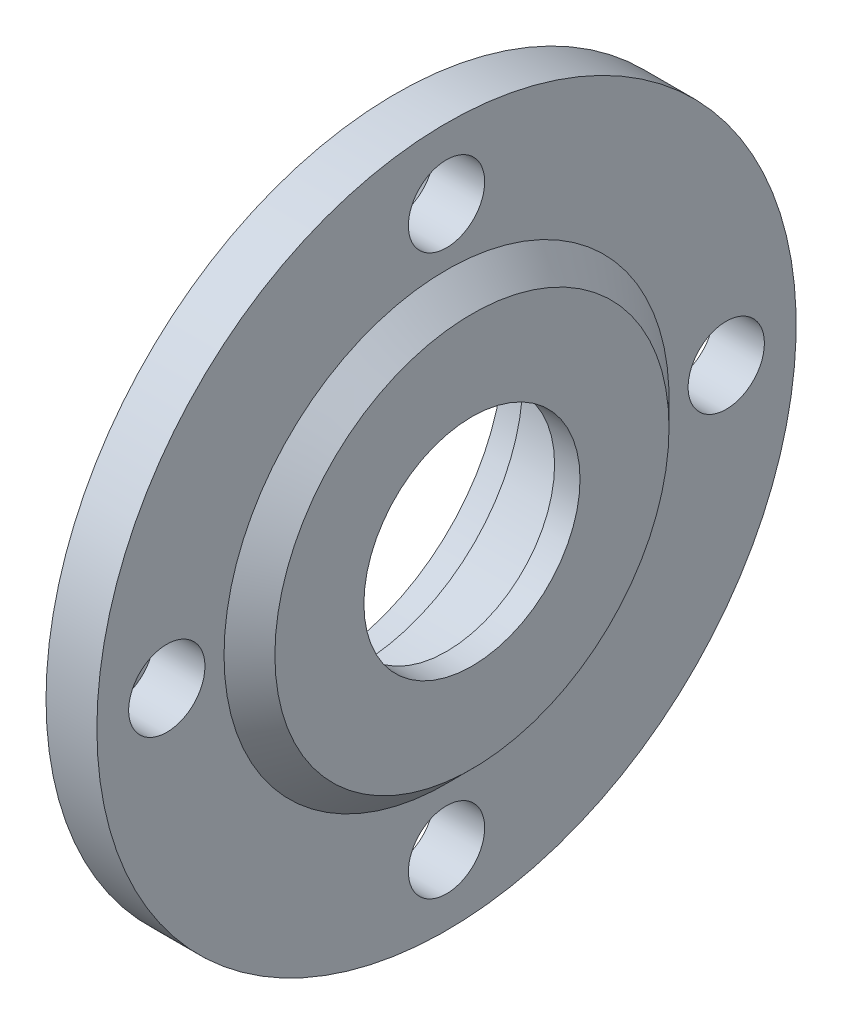
ISO-10303-21;
HEADER;
FILE_DESCRIPTION(('STEP AP214'),'2;1');
FILE_NAME('part.step','',(''),(''),'','','');
FILE_SCHEMA(('AUTOMOTIVE_DESIGN { 1 0 10303 214 1 1 1 1 }'));
ENDSEC;
DATA;
#1=APPLICATION_CONTEXT('core data for automotive mechanical design processes');
#2=APPLICATION_PROTOCOL_DEFINITION('international standard','automotive_design',2000,#1);
#3=PRODUCT_CONTEXT('',#1,'mechanical');
#4=PRODUCT('Part','Part','',(#3));
#5=PRODUCT_RELATED_PRODUCT_CATEGORY('part','',(#4));
#6=PRODUCT_DEFINITION_FORMATION('','',#4);
#7=PRODUCT_DEFINITION_CONTEXT('part definition',#1,'design');
#8=PRODUCT_DEFINITION('design','',#6,#7);
#9=PRODUCT_DEFINITION_SHAPE('','',#8);
#10=(LENGTH_UNIT() NAMED_UNIT(*) SI_UNIT(.MILLI.,.METRE.));
#11=(NAMED_UNIT(*) PLANE_ANGLE_UNIT() SI_UNIT($,.RADIAN.));
#12=(NAMED_UNIT(*) SI_UNIT($,.STERADIAN.) SOLID_ANGLE_UNIT());
#13=UNCERTAINTY_MEASURE_WITH_UNIT(LENGTH_MEASURE(1.E-05),#10,'distance_accuracy_value','');
#14=(GEOMETRIC_REPRESENTATION_CONTEXT(3) GLOBAL_UNCERTAINTY_ASSIGNED_CONTEXT((#13)) GLOBAL_UNIT_ASSIGNED_CONTEXT((#10,
#11,#12)) REPRESENTATION_CONTEXT('',''));
#15=CARTESIAN_POINT('',(0.,0.,0.));
#16=DIRECTION('',(0.,0.,1.));
#17=DIRECTION('',(1.,0.,0.));
#18=AXIS2_PLACEMENT_3D('',#15,#16,#17);
#19=CARTESIAN_POINT('',(18.8922012735046,0.,-13.));
#20=DIRECTION('',(1.,0.,0.));
#21=DIRECTION('',(0.,0.,-1.));
#22=AXIS2_PLACEMENT_3D('',#19,#20,#21);
#23=PLANE('',#22);
#24=CARTESIAN_POINT('',(18.8922012735046,0.,0.));
#25=DIRECTION('',(-1.,0.,0.));
#26=DIRECTION('',(0.,0.,1.));
#27=AXIS2_PLACEMENT_3D('',#24,#25,#26);
#28=CIRCLE('',#27,8.5);
#29=CARTESIAN_POINT('',(18.8922012735046,0.,8.5));
#30=VERTEX_POINT('',#29);
#31=EDGE_CURVE('E10',#30,#30,#28,.T.);
#32=ORIENTED_EDGE('',*,*,#31,.F.);
#33=EDGE_LOOP('',(#32));
#34=FACE_BOUND('',#33,.T.);
#35=CARTESIAN_POINT('',(18.8922012735046,0.,0.));
#36=DIRECTION('',(-1.,0.,0.));
#37=DIRECTION('',(0.,0.,1.));
#38=AXIS2_PLACEMENT_3D('',#35,#36,#37);
#39=CIRCLE('',#38,13.);
#40=CARTESIAN_POINT('',(18.8922012735046,0.,13.));
#41=VERTEX_POINT('',#40);
#42=EDGE_CURVE('E70',#41,#41,#39,.T.);
#43=ORIENTED_EDGE('',*,*,#42,.T.);
#44=EDGE_LOOP('',(#43));
#45=FACE_BOUND('',#44,.T.);
#46=ADVANCED_FACE('F37',(#34,#45),#23,.F.);
#47=CARTESIAN_POINT('',(0.,0.,0.));
#48=DIRECTION('',(-1.,0.,0.));
#49=DIRECTION('',(0.,0.,1.));
#50=AXIS2_PLACEMENT_3D('',#47,#48,#49);
#51=CYLINDRICAL_SURFACE('',#50,8.5);
#52=CARTESIAN_POINT('',(20.8922012735046,0.,0.));
#53=DIRECTION('',(-1.,0.,0.));
#54=DIRECTION('',(0.,0.,1.));
#55=AXIS2_PLACEMENT_3D('',#52,#53,#54);
#56=CIRCLE('',#55,8.5);
#57=CARTESIAN_POINT('',(20.8922012735046,0.,8.5));
#58=VERTEX_POINT('',#57);
#59=EDGE_CURVE('E45',#58,#58,#56,.T.);
#60=ORIENTED_EDGE('',*,*,#59,.F.);
#61=EDGE_LOOP('',(#60));
#62=FACE_BOUND('',#61,.T.);
#63=ORIENTED_EDGE('',*,*,#31,.T.);
#64=EDGE_LOOP('',(#63));
#65=FACE_BOUND('',#64,.T.);
#66=ADVANCED_FACE('F122',(#62,#65),#51,.F.);
#67=CARTESIAN_POINT('',(20.8922012735046,0.,-8.5));
#68=DIRECTION('',(-1.,0.,0.));
#69=DIRECTION('',(0.,0.,1.));
#70=AXIS2_PLACEMENT_3D('',#67,#68,#69);
#71=PLANE('',#70);
#72=CARTESIAN_POINT('',(20.8922012735046,0.,0.));
#73=DIRECTION('',(-1.,0.,0.));
#74=DIRECTION('',(0.,0.,1.));
#75=AXIS2_PLACEMENT_3D('',#72,#73,#74);
#76=CIRCLE('',#75,15.5);
#77=CARTESIAN_POINT('',(20.8922012735046,0.,15.5));
#78=VERTEX_POINT('',#77);
#79=EDGE_CURVE('E51',#78,#78,#76,.T.);
#80=ORIENTED_EDGE('',*,*,#79,.F.);
#81=EDGE_LOOP('',(#80));
#82=FACE_BOUND('',#81,.T.);
#83=ORIENTED_EDGE('',*,*,#59,.T.);
#84=EDGE_LOOP('',(#83));
#85=FACE_BOUND('',#84,.T.);
#86=ADVANCED_FACE('F119',(#82,#85),#71,.F.);
#87=CARTESIAN_POINT('',(20.8922012735046,0.,0.));
#88=DIRECTION('',(-1.,0.,0.));
#89=DIRECTION('',(0.,0.,1.));
#90=AXIS2_PLACEMENT_3D('',#87,#88,#89);
#91=CONICAL_SURFACE('',#90,15.5,0.785398163397447);
#92=CARTESIAN_POINT('',(18.8922012735046,0.,0.));
#93=DIRECTION('',(-1.,0.,0.));
#94=DIRECTION('',(0.,0.,1.));
#95=AXIS2_PLACEMENT_3D('',#92,#93,#94);
#96=CIRCLE('',#95,17.5);
#97=CARTESIAN_POINT('',(18.8922012735046,0.,17.5));
#98=VERTEX_POINT('',#97);
#99=EDGE_CURVE('E110',#98,#98,#96,.T.);
#100=ORIENTED_EDGE('',*,*,#99,.F.);
#101=EDGE_LOOP('',(#100));
#102=FACE_BOUND('',#101,.T.);
#103=ORIENTED_EDGE('',*,*,#79,.T.);
#104=EDGE_LOOP('',(#103));
#105=FACE_BOUND('',#104,.T.);
#106=ADVANCED_FACE('F117',(#102,#105),#91,.T.);
#107=CARTESIAN_POINT('',(18.8922012735046,0.,-17.5));
#108=DIRECTION('',(-1.,0.,0.));
#109=DIRECTION('',(0.,0.,1.));
#110=AXIS2_PLACEMENT_3D('',#107,#108,#109);
#111=PLANE('',#110);
#112=CARTESIAN_POINT('',(18.8922012735046,22.,0.));
#113=DIRECTION('',(1.,0.,0.));
#114=DIRECTION('',(0.,0.,-1.));
#115=AXIS2_PLACEMENT_3D('',#112,#113,#114);
#116=CIRCLE('',#115,3.);
#117=CARTESIAN_POINT('',(18.8922012735046,22.,-3.));
#118=VERTEX_POINT('',#117);
#119=EDGE_CURVE('E60',#118,#118,#116,.T.);
#120=ORIENTED_EDGE('',*,*,#119,.F.);
#121=EDGE_LOOP('',(#120));
#122=FACE_BOUND('',#121,.T.);
#123=CARTESIAN_POINT('',(18.8922012735046,6.21236273031702E-13,-22.0000000000006));
#124=DIRECTION('',(1.,0.,0.));
#125=DIRECTION('',(0.,0.,-1.));
#126=AXIS2_PLACEMENT_3D('',#123,#124,#125);
#127=CIRCLE('',#126,3.00000000000049);
#128=CARTESIAN_POINT('',(18.8922012735046,6.21236273031702E-13,-25.0000000000011));
#129=VERTEX_POINT('',#128);
#130=EDGE_CURVE('E187',#129,#129,#127,.T.);
#131=ORIENTED_EDGE('',*,*,#130,.F.);
#132=EDGE_LOOP('',(#131));
#133=FACE_BOUND('',#132,.T.);
#134=CARTESIAN_POINT('',(18.8922012735046,-22.,-1.2424725460634E-12));
#135=DIRECTION('',(1.,0.,0.));
#136=DIRECTION('',(0.,0.,-1.));
#137=AXIS2_PLACEMENT_3D('',#134,#135,#136);
#138=CIRCLE('',#137,3.00000000000133);
#139=CARTESIAN_POINT('',(18.8922012735046,-22.,-3.00000000000258));
#140=VERTEX_POINT('',#139);
#141=EDGE_CURVE('E191',#140,#140,#138,.T.);
#142=ORIENTED_EDGE('',*,*,#141,.F.);
#143=EDGE_LOOP('',(#142));
#144=FACE_BOUND('',#143,.T.);
#145=CARTESIAN_POINT('',(18.8922012735046,-6.23930495989826E-13,21.9999999999994));
#146=DIRECTION('',(1.,0.,0.));
#147=DIRECTION('',(0.,0.,-1.));
#148=AXIS2_PLACEMENT_3D('',#145,#146,#147);
#149=CIRCLE('',#148,3.000000000001);
#150=CARTESIAN_POINT('',(18.8922012735046,-6.23930495989826E-13,18.9999999999984));
#151=VERTEX_POINT('',#150);
#152=EDGE_CURVE('E84',#151,#151,#149,.T.);
#153=ORIENTED_EDGE('',*,*,#152,.F.);
#154=EDGE_LOOP('',(#153));
#155=FACE_BOUND('',#154,.T.);
#156=CARTESIAN_POINT('',(18.8922012735046,0.,0.));
#157=DIRECTION('',(-1.,0.,0.));
#158=DIRECTION('',(0.,0.,1.));
#159=AXIS2_PLACEMENT_3D('',#156,#157,#158);
#160=CIRCLE('',#159,27.5);
#161=CARTESIAN_POINT('',(18.8922012735046,0.,27.5));
#162=VERTEX_POINT('',#161);
#163=EDGE_CURVE('E106',#162,#162,#160,.T.);
#164=ORIENTED_EDGE('',*,*,#163,.F.);
#165=EDGE_LOOP('',(#164));
#166=FACE_BOUND('',#165,.T.);
#167=ORIENTED_EDGE('',*,*,#99,.T.);
#168=EDGE_LOOP('',(#167));
#169=FACE_BOUND('',#168,.T.);
#170=ADVANCED_FACE('F134',(#122,#133,#144,#155,#166,#169),#111,.F.);
#171=CARTESIAN_POINT('',(0.,0.,0.));
#172=DIRECTION('',(-1.,0.,0.));
#173=DIRECTION('',(0.,0.,1.));
#174=AXIS2_PLACEMENT_3D('',#171,#172,#173);
#175=CYLINDRICAL_SURFACE('',#174,27.5);
#176=CARTESIAN_POINT('',(14.8922012735046,0.,0.));
#177=DIRECTION('',(-1.,0.,0.));
#178=DIRECTION('',(0.,0.,1.));
#179=AXIS2_PLACEMENT_3D('',#176,#177,#178);
#180=CIRCLE('',#179,27.5);
#181=CARTESIAN_POINT('',(14.8922012735046,0.,27.5));
#182=VERTEX_POINT('',#181);
#183=EDGE_CURVE('E102',#182,#182,#180,.T.);
#184=ORIENTED_EDGE('',*,*,#183,.F.);
#185=EDGE_LOOP('',(#184));
#186=FACE_BOUND('',#185,.T.);
#187=ORIENTED_EDGE('',*,*,#163,.T.);
#188=EDGE_LOOP('',(#187));
#189=FACE_BOUND('',#188,.T.);
#190=ADVANCED_FACE('F138',(#186,#189),#175,.T.);
#191=CARTESIAN_POINT('',(14.8922012735046,0.,-27.5));
#192=DIRECTION('',(1.,0.,0.));
#193=DIRECTION('',(0.,0.,-1.));
#194=AXIS2_PLACEMENT_3D('',#191,#192,#193);
#195=PLANE('',#194);
#196=CARTESIAN_POINT('',(14.8922012735046,22.,0.));
#197=DIRECTION('',(1.,0.,0.));
#198=DIRECTION('',(0.,0.,-1.));
#199=AXIS2_PLACEMENT_3D('',#196,#197,#198);
#200=CIRCLE('',#199,3.);
#201=CARTESIAN_POINT('',(14.8922012735046,22.,-3.));
#202=VERTEX_POINT('',#201);
#203=EDGE_CURVE('E40',#202,#202,#200,.T.);
#204=ORIENTED_EDGE('',*,*,#203,.T.);
#205=EDGE_LOOP('',(#204));
#206=FACE_BOUND('',#205,.T.);
#207=CARTESIAN_POINT('',(14.8922012735046,6.21236273031702E-13,-22.0000000000006));
#208=DIRECTION('',(1.,0.,0.));
#209=DIRECTION('',(0.,0.,-1.));
#210=AXIS2_PLACEMENT_3D('',#207,#208,#209);
#211=CIRCLE('',#210,3.00000000000049);
#212=CARTESIAN_POINT('',(14.8922012735046,6.21236273031702E-13,-25.0000000000011));
#213=VERTEX_POINT('',#212);
#214=EDGE_CURVE('E63',#213,#213,#211,.T.);
#215=ORIENTED_EDGE('',*,*,#214,.T.);
#216=EDGE_LOOP('',(#215));
#217=FACE_BOUND('',#216,.T.);
#218=CARTESIAN_POINT('',(14.8922012735046,-22.,-1.2424725460634E-12));
#219=DIRECTION('',(1.,0.,0.));
#220=DIRECTION('',(0.,0.,-1.));
#221=AXIS2_PLACEMENT_3D('',#218,#219,#220);
#222=CIRCLE('',#221,3.00000000000133);
#223=CARTESIAN_POINT('',(14.8922012735046,-22.,-3.00000000000258));
#224=VERTEX_POINT('',#223);
#225=EDGE_CURVE('E59',#224,#224,#222,.T.);
#226=ORIENTED_EDGE('',*,*,#225,.T.);
#227=EDGE_LOOP('',(#226));
#228=FACE_BOUND('',#227,.T.);
#229=CARTESIAN_POINT('',(14.8922012735046,-6.23930495989826E-13,21.9999999999994));
#230=DIRECTION('',(1.,0.,0.));
#231=DIRECTION('',(0.,0.,-1.));
#232=AXIS2_PLACEMENT_3D('',#229,#230,#231);
#233=CIRCLE('',#232,3.000000000001);
#234=CARTESIAN_POINT('',(14.8922012735046,-6.23930495989826E-13,18.9999999999984));
#235=VERTEX_POINT('',#234);
#236=EDGE_CURVE('E55',#235,#235,#233,.T.);
#237=ORIENTED_EDGE('',*,*,#236,.T.);
#238=EDGE_LOOP('',(#237));
#239=FACE_BOUND('',#238,.T.);
#240=CARTESIAN_POINT('',(14.8922012735046,0.,0.));
#241=DIRECTION('',(-1.,0.,0.));
#242=DIRECTION('',(0.,0.,1.));
#243=AXIS2_PLACEMENT_3D('',#240,#241,#242);
#244=CIRCLE('',#243,17.5);
#245=CARTESIAN_POINT('',(14.8922012735046,0.,17.5));
#246=VERTEX_POINT('',#245);
#247=EDGE_CURVE('E98',#246,#246,#244,.T.);
#248=ORIENTED_EDGE('',*,*,#247,.F.);
#249=EDGE_LOOP('',(#248));
#250=FACE_BOUND('',#249,.T.);
#251=ORIENTED_EDGE('',*,*,#183,.T.);
#252=EDGE_LOOP('',(#251));
#253=FACE_BOUND('',#252,.T.);
#254=ADVANCED_FACE('F142',(#206,#217,#228,#239,#250,#253),#195,.F.);
#255=CARTESIAN_POINT('',(0.,0.,0.));
#256=DIRECTION('',(-1.,0.,0.));
#257=DIRECTION('',(0.,0.,1.));
#258=AXIS2_PLACEMENT_3D('',#255,#256,#257);
#259=CYLINDRICAL_SURFACE('',#258,17.5);
#260=CARTESIAN_POINT('',(8.89220127350458,0.,0.));
#261=DIRECTION('',(-1.,0.,0.));
#262=DIRECTION('',(0.,0.,1.));
#263=AXIS2_PLACEMENT_3D('',#260,#261,#262);
#264=CIRCLE('',#263,17.5);
#265=CARTESIAN_POINT('',(8.89220127350458,0.,17.5));
#266=VERTEX_POINT('',#265);
#267=EDGE_CURVE('E94',#266,#266,#264,.T.);
#268=ORIENTED_EDGE('',*,*,#267,.F.);
#269=EDGE_LOOP('',(#268));
#270=FACE_BOUND('',#269,.T.);
#271=ORIENTED_EDGE('',*,*,#247,.T.);
#272=EDGE_LOOP('',(#271));
#273=FACE_BOUND('',#272,.T.);
#274=ADVANCED_FACE('F146',(#270,#273),#259,.T.);
#275=CARTESIAN_POINT('',(8.89220127350458,0.,-17.5));
#276=DIRECTION('',(1.,0.,0.));
#277=DIRECTION('',(0.,0.,-1.));
#278=AXIS2_PLACEMENT_3D('',#275,#276,#277);
#279=PLANE('',#278);
#280=CARTESIAN_POINT('',(8.89220127350458,0.,0.));
#281=DIRECTION('',(-1.,0.,0.));
#282=DIRECTION('',(0.,0.,1.));
#283=AXIS2_PLACEMENT_3D('',#280,#281,#282);
#284=CIRCLE('',#283,14.5);
#285=CARTESIAN_POINT('',(8.89220127350458,0.,14.5));
#286=VERTEX_POINT('',#285);
#287=EDGE_CURVE('E90',#286,#286,#284,.T.);
#288=ORIENTED_EDGE('',*,*,#287,.F.);
#289=EDGE_LOOP('',(#288));
#290=FACE_BOUND('',#289,.T.);
#291=ORIENTED_EDGE('',*,*,#267,.T.);
#292=EDGE_LOOP('',(#291));
#293=FACE_BOUND('',#292,.T.);
#294=ADVANCED_FACE('F149',(#290,#293),#279,.F.);
#295=CARTESIAN_POINT('',(0.,0.,0.));
#296=DIRECTION('',(-1.,0.,0.));
#297=DIRECTION('',(0.,0.,1.));
#298=AXIS2_PLACEMENT_3D('',#295,#296,#297);
#299=CYLINDRICAL_SURFACE('',#298,14.5);
#300=CARTESIAN_POINT('',(11.8922012735046,0.,0.));
#301=DIRECTION('',(-1.,0.,0.));
#302=DIRECTION('',(0.,0.,1.));
#303=AXIS2_PLACEMENT_3D('',#300,#301,#302);
#304=CIRCLE('',#303,14.5);
#305=CARTESIAN_POINT('',(11.8922012735046,0.,14.5));
#306=VERTEX_POINT('',#305);
#307=EDGE_CURVE('E81',#306,#306,#304,.T.);
#308=ORIENTED_EDGE('',*,*,#307,.F.);
#309=EDGE_LOOP('',(#308));
#310=FACE_BOUND('',#309,.T.);
#311=ORIENTED_EDGE('',*,*,#287,.T.);
#312=EDGE_LOOP('',(#311));
#313=FACE_BOUND('',#312,.T.);
#314=ADVANCED_FACE('F153',(#310,#313),#299,.F.);
#315=CARTESIAN_POINT('',(11.8922012735046,0.,-14.5));
#316=DIRECTION('',(1.,0.,0.));
#317=DIRECTION('',(0.,0.,-1.));
#318=AXIS2_PLACEMENT_3D('',#315,#316,#317);
#319=PLANE('',#318);
#320=CARTESIAN_POINT('',(11.8922012735046,0.,0.));
#321=DIRECTION('',(-1.,0.,0.));
#322=DIRECTION('',(0.,0.,1.));
#323=AXIS2_PLACEMENT_3D('',#320,#321,#322);
#324=CIRCLE('',#323,13.);
#325=CARTESIAN_POINT('',(11.8922012735046,0.,13.));
#326=VERTEX_POINT('',#325);
#327=EDGE_CURVE('E75',#326,#326,#324,.T.);
#328=ORIENTED_EDGE('',*,*,#327,.F.);
#329=EDGE_LOOP('',(#328));
#330=FACE_BOUND('',#329,.T.);
#331=ORIENTED_EDGE('',*,*,#307,.T.);
#332=EDGE_LOOP('',(#331));
#333=FACE_BOUND('',#332,.T.);
#334=ADVANCED_FACE('F157',(#330,#333),#319,.F.);
#335=CARTESIAN_POINT('',(0.,0.,0.));
#336=DIRECTION('',(-1.,0.,0.));
#337=DIRECTION('',(0.,0.,1.));
#338=AXIS2_PLACEMENT_3D('',#335,#336,#337);
#339=CYLINDRICAL_SURFACE('',#338,13.);
#340=ORIENTED_EDGE('',*,*,#42,.F.);
#341=EDGE_LOOP('',(#340));
#342=FACE_BOUND('',#341,.T.);
#343=ORIENTED_EDGE('',*,*,#327,.T.);
#344=EDGE_LOOP('',(#343));
#345=FACE_BOUND('',#344,.T.);
#346=ADVANCED_FACE('F161',(#342,#345),#339,.F.);
#347=CARTESIAN_POINT('',(8.89220127350458,-6.23930495989826E-13,21.9999999999994));
#348=DIRECTION('',(1.,0.,0.));
#349=DIRECTION('',(0.,0.,-1.));
#350=AXIS2_PLACEMENT_3D('',#347,#348,#349);
#351=CYLINDRICAL_SURFACE('',#350,3.000000000001);
#352=ORIENTED_EDGE('',*,*,#152,.T.);
#353=EDGE_LOOP('',(#352));
#354=FACE_BOUND('',#353,.T.);
#355=ORIENTED_EDGE('',*,*,#236,.F.);
#356=EDGE_LOOP('',(#355));
#357=FACE_BOUND('',#356,.T.);
#358=ADVANCED_FACE('F165',(#354,#357),#351,.F.);
#359=CARTESIAN_POINT('',(8.89220127350458,-22.,-1.2424725460634E-12));
#360=DIRECTION('',(1.,0.,0.));
#361=DIRECTION('',(0.,0.,-1.));
#362=AXIS2_PLACEMENT_3D('',#359,#360,#361);
#363=CYLINDRICAL_SURFACE('',#362,3.00000000000133);
#364=ORIENTED_EDGE('',*,*,#141,.T.);
#365=EDGE_LOOP('',(#364));
#366=FACE_BOUND('',#365,.T.);
#367=ORIENTED_EDGE('',*,*,#225,.F.);
#368=EDGE_LOOP('',(#367));
#369=FACE_BOUND('',#368,.T.);
#370=ADVANCED_FACE('F169',(#366,#369),#363,.F.);
#371=CARTESIAN_POINT('',(8.89220127350458,6.21236273031702E-13,-22.0000000000006));
#372=DIRECTION('',(1.,0.,0.));
#373=DIRECTION('',(0.,0.,-1.));
#374=AXIS2_PLACEMENT_3D('',#371,#372,#373);
#375=CYLINDRICAL_SURFACE('',#374,3.00000000000049);
#376=ORIENTED_EDGE('',*,*,#130,.T.);
#377=EDGE_LOOP('',(#376));
#378=FACE_BOUND('',#377,.T.);
#379=ORIENTED_EDGE('',*,*,#214,.F.);
#380=EDGE_LOOP('',(#379));
#381=FACE_BOUND('',#380,.T.);
#382=ADVANCED_FACE('F173',(#378,#381),#375,.F.);
#383=CARTESIAN_POINT('',(8.89220127350458,22.,0.));
#384=DIRECTION('',(1.,0.,0.));
#385=DIRECTION('',(0.,0.,-1.));
#386=AXIS2_PLACEMENT_3D('',#383,#384,#385);
#387=CYLINDRICAL_SURFACE('',#386,3.);
#388=ORIENTED_EDGE('',*,*,#119,.T.);
#389=EDGE_LOOP('',(#388));
#390=FACE_BOUND('',#389,.T.);
#391=ORIENTED_EDGE('',*,*,#203,.F.);
#392=EDGE_LOOP('',(#391));
#393=FACE_BOUND('',#392,.T.);
#394=ADVANCED_FACE('F177',(#390,#393),#387,.F.);
#395=CLOSED_SHELL('',(#46,#66,#86,#106,#170,#190,#254,#274,#294,#314,#334,#346,#358,#370,#382,#394));
#396=MANIFOLD_SOLID_BREP('B2',#395);
#397=ADVANCED_BREP_SHAPE_REPRESENTATION('',(#18,#396),#14);
#398=SHAPE_DEFINITION_REPRESENTATION(#9,#397);
ENDSEC;
END-ISO-10303-21;
